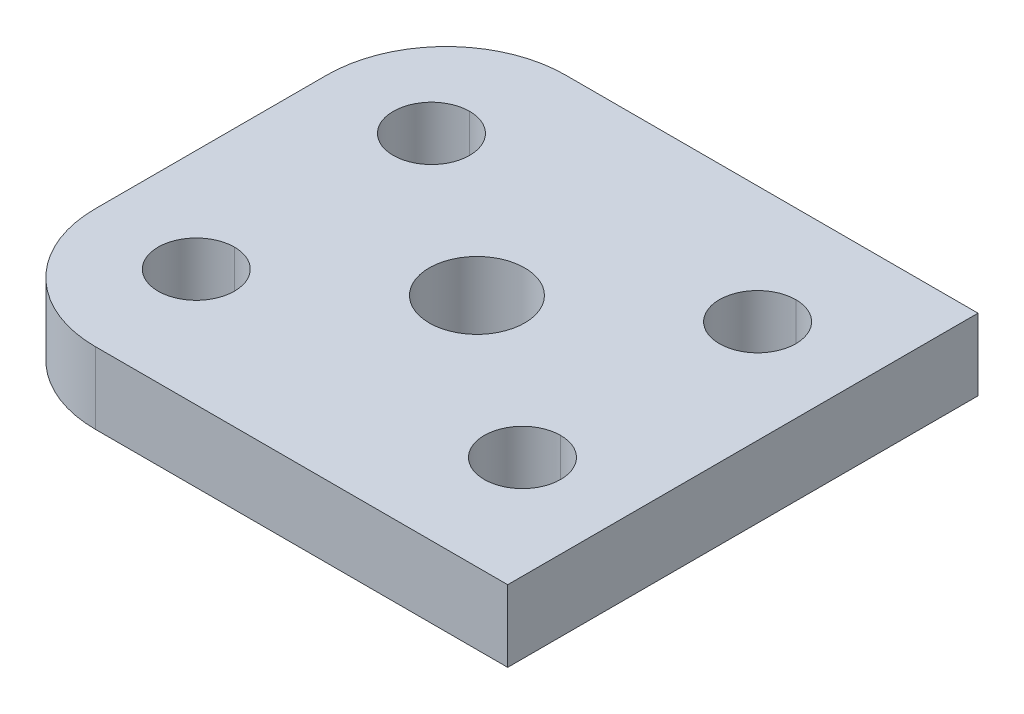
ISO-10303-21;
HEADER;
FILE_DESCRIPTION(('STEP AP214'),'2;1');
FILE_NAME('part.step','',(''),(''),'','','');
FILE_SCHEMA(('AUTOMOTIVE_DESIGN { 1 0 10303 214 1 1 1 1 }'));
ENDSEC;
DATA;
#1=APPLICATION_CONTEXT('core data for automotive mechanical design processes');
#2=APPLICATION_PROTOCOL_DEFINITION('international standard','automotive_design',2000,#1);
#3=PRODUCT_CONTEXT('',#1,'mechanical');
#4=PRODUCT('Part','Part','',(#3));
#5=PRODUCT_RELATED_PRODUCT_CATEGORY('part','',(#4));
#6=PRODUCT_DEFINITION_FORMATION('','',#4);
#7=PRODUCT_DEFINITION_CONTEXT('part definition',#1,'design');
#8=PRODUCT_DEFINITION('design','',#6,#7);
#9=PRODUCT_DEFINITION_SHAPE('','',#8);
#10=(LENGTH_UNIT() NAMED_UNIT(*) SI_UNIT(.MILLI.,.METRE.));
#11=(NAMED_UNIT(*) PLANE_ANGLE_UNIT() SI_UNIT($,.RADIAN.));
#12=(NAMED_UNIT(*) SI_UNIT($,.STERADIAN.) SOLID_ANGLE_UNIT());
#13=UNCERTAINTY_MEASURE_WITH_UNIT(LENGTH_MEASURE(1.E-05),#10,'distance_accuracy_value','');
#14=(GEOMETRIC_REPRESENTATION_CONTEXT(3) GLOBAL_UNCERTAINTY_ASSIGNED_CONTEXT((#13)) GLOBAL_UNIT_ASSIGNED_CONTEXT((#10,
#11,#12)) REPRESENTATION_CONTEXT('',''));
#15=CARTESIAN_POINT('',(0.,0.,0.));
#16=DIRECTION('',(0.,0.,1.));
#17=DIRECTION('',(1.,0.,0.));
#18=AXIS2_PLACEMENT_3D('',#15,#16,#17);
#19=CARTESIAN_POINT('',(-8.70071310472377,3.,-9.66703927731969));
#20=DIRECTION('',(0.,1.,0.));
#21=DIRECTION('',(0.,0.,1.));
#22=AXIS2_PLACEMENT_3D('',#19,#20,#21);
#23=CYLINDRICAL_SURFACE('',#22,5.);
#24=CARTESIAN_POINT('',(-8.70071310472377,3.,-9.66703927731969));
#25=DIRECTION('',(0.,1.,0.));
#26=DIRECTION('',(0.,0.,1.));
#27=AXIS2_PLACEMENT_3D('',#24,#25,#26);
#28=CIRCLE('',#27,5.);
#29=CARTESIAN_POINT('',(-8.70071310472377,3.,-14.6670392773197));
#30=VERTEX_POINT('',#29);
#31=CARTESIAN_POINT('',(-13.7007131047238,3.,-9.66703927731969));
#32=VERTEX_POINT('',#31);
#33=EDGE_CURVE('E246',#30,#32,#28,.T.);
#34=ORIENTED_EDGE('',*,*,#33,.F.);
#35=DIRECTION('',(0.,1.,0.));
#36=VECTOR('',#35,1.);
#37=CARTESIAN_POINT('',(-8.70071310472377,3.,-14.6670392773197));
#38=LINE('',#37,#36);
#39=CARTESIAN_POINT('',(-8.70071310472377,0.,-14.6670392773197));
#40=VERTEX_POINT('',#39);
#41=EDGE_CURVE('E248',#40,#30,#38,.T.);
#42=ORIENTED_EDGE('',*,*,#41,.F.);
#43=CARTESIAN_POINT('',(-8.70071310472377,0.,-9.66703927731969));
#44=DIRECTION('',(0.,-1.,0.));
#45=DIRECTION('',(0.,0.,1.));
#46=AXIS2_PLACEMENT_3D('',#43,#44,#45);
#47=CIRCLE('',#46,5.);
#48=CARTESIAN_POINT('',(-13.7007131047238,0.,-9.66703927731969));
#49=VERTEX_POINT('',#48);
#50=EDGE_CURVE('E281',#49,#40,#47,.T.);
#51=ORIENTED_EDGE('',*,*,#50,.F.);
#52=DIRECTION('',(0.,-1.,0.));
#53=VECTOR('',#52,1.);
#54=CARTESIAN_POINT('',(-13.7007131047238,0.,-9.66703927731969));
#55=LINE('',#54,#53);
#56=EDGE_CURVE('E11',#32,#49,#55,.T.);
#57=ORIENTED_EDGE('',*,*,#56,.F.);
#58=EDGE_LOOP('',(#34,#42,#51,#57));
#59=FACE_BOUND('',#58,.T.);
#60=ADVANCED_FACE('F51',(#59),#23,.T.);
#61=CARTESIAN_POINT('',(-8.70071310472377,3.,0.0329607226803095));
#62=DIRECTION('',(0.,1.,0.));
#63=DIRECTION('',(0.,0.,1.));
#64=AXIS2_PLACEMENT_3D('',#61,#62,#63);
#65=CYLINDRICAL_SURFACE('',#64,5.);
#66=CARTESIAN_POINT('',(-8.70071310472377,3.,0.0329607226803095));
#67=DIRECTION('',(0.,1.,0.));
#68=DIRECTION('',(0.,0.,1.));
#69=AXIS2_PLACEMENT_3D('',#66,#67,#68);
#70=CIRCLE('',#69,5.);
#71=CARTESIAN_POINT('',(-13.7007131047238,3.,0.03296072268031));
#72=VERTEX_POINT('',#71);
#73=CARTESIAN_POINT('',(-8.70071310472377,3.,5.03296072268031));
#74=VERTEX_POINT('',#73);
#75=EDGE_CURVE('E286',#72,#74,#70,.T.);
#76=ORIENTED_EDGE('',*,*,#75,.F.);
#77=DIRECTION('',(0.,1.,0.));
#78=VECTOR('',#77,1.);
#79=CARTESIAN_POINT('',(-13.7007131047238,3.,0.0329607226803095));
#80=LINE('',#79,#78);
#81=CARTESIAN_POINT('',(-13.7007131047238,0.,0.03296072268031));
#82=VERTEX_POINT('',#81);
#83=EDGE_CURVE('E62',#82,#72,#80,.T.);
#84=ORIENTED_EDGE('',*,*,#83,.F.);
#85=CARTESIAN_POINT('',(-8.70071310472377,0.,0.0329607226803095));
#86=DIRECTION('',(0.,-1.,0.));
#87=DIRECTION('',(0.,0.,1.));
#88=AXIS2_PLACEMENT_3D('',#85,#86,#87);
#89=CIRCLE('',#88,5.);
#90=CARTESIAN_POINT('',(-8.70071310472377,0.,5.03296072268031));
#91=VERTEX_POINT('',#90);
#92=EDGE_CURVE('E282',#91,#82,#89,.T.);
#93=ORIENTED_EDGE('',*,*,#92,.F.);
#94=DIRECTION('',(0.,-1.,0.));
#95=VECTOR('',#94,1.);
#96=CARTESIAN_POINT('',(-8.70071310472377,0.,5.03296072268031));
#97=LINE('',#96,#95);
#98=EDGE_CURVE('E55',#74,#91,#97,.T.);
#99=ORIENTED_EDGE('',*,*,#98,.F.);
#100=EDGE_LOOP('',(#76,#84,#93,#99));
#101=FACE_BOUND('',#100,.T.);
#102=ADVANCED_FACE('F497',(#101),#65,.T.);
#103=CARTESIAN_POINT('',(-13.7007131047238,3.,-14.6670392773197));
#104=DIRECTION('',(-1.,0.,0.));
#105=DIRECTION('',(0.,0.,1.));
#106=AXIS2_PLACEMENT_3D('',#103,#104,#105);
#107=PLANE('',#106);
#108=DIRECTION('',(0.,0.,-1.));
#109=VECTOR('',#108,1.);
#110=CARTESIAN_POINT('',(-13.7007131047238,0.,-14.6670392773197));
#111=LINE('',#110,#109);
#112=EDGE_CURVE('E277',#82,#49,#111,.T.);
#113=ORIENTED_EDGE('',*,*,#112,.F.);
#114=ORIENTED_EDGE('',*,*,#83,.T.);
#115=DIRECTION('',(0.,0.,-1.));
#116=VECTOR('',#115,1.);
#117=CARTESIAN_POINT('',(-13.7007131047238,3.,-14.6670392773197));
#118=LINE('',#117,#116);
#119=EDGE_CURVE('E283',#72,#32,#118,.T.);
#120=ORIENTED_EDGE('',*,*,#119,.T.);
#121=ORIENTED_EDGE('',*,*,#56,.T.);
#122=EDGE_LOOP('',(#113,#114,#120,#121));
#123=FACE_BOUND('',#122,.T.);
#124=ADVANCED_FACE('F501',(#123),#107,.T.);
#125=CARTESIAN_POINT('',(0.,0.,0.));
#126=DIRECTION('',(0.,1.,0.));
#127=DIRECTION('',(1.,0.,0.));
#128=AXIS2_PLACEMENT_3D('',#125,#126,#127);
#129=PLANE('',#128);
#130=CARTESIAN_POINT('',(4.26861546934696,0.,-9.74203927685791));
#131=DIRECTION('',(0.,1.,0.));
#132=DIRECTION('',(0.,0.,1.));
#133=AXIS2_PLACEMENT_3D('',#130,#131,#132);
#134=CIRCLE('',#133,1.6);
#135=CARTESIAN_POINT('',(4.26861546934696,0.,-11.3420392768579));
#136=VERTEX_POINT('',#135);
#137=CARTESIAN_POINT('',(4.26861546934696,0.,-8.14203927685791));
#138=VERTEX_POINT('',#137);
#139=EDGE_CURVE('E296',#136,#138,#134,.T.);
#140=ORIENTED_EDGE('',*,*,#139,.T.);
#141=CARTESIAN_POINT('',(4.26861546934696,0.,-9.74203927685791));
#142=DIRECTION('',(0.,1.,0.));
#143=DIRECTION('',(0.,0.,1.));
#144=AXIS2_PLACEMENT_3D('',#141,#142,#143);
#145=CIRCLE('',#144,1.6);
#146=EDGE_CURVE('E185',#138,#136,#145,.T.);
#147=ORIENTED_EDGE('',*,*,#146,.T.);
#148=EDGE_LOOP('',(#140,#147));
#149=FACE_BOUND('',#148,.T.);
#150=CARTESIAN_POINT('',(4.26861546934696,0.,0.107960722834236));
#151=DIRECTION('',(0.,1.,0.));
#152=DIRECTION('',(0.,0.,1.));
#153=AXIS2_PLACEMENT_3D('',#150,#151,#152);
#154=CIRCLE('',#153,1.6);
#155=CARTESIAN_POINT('',(4.26861546934696,0.,-1.49203927716576));
#156=VERTEX_POINT('',#155);
#157=CARTESIAN_POINT('',(4.26861546934696,0.,1.70796072283424));
#158=VERTEX_POINT('',#157);
#159=EDGE_CURVE('E198',#156,#158,#154,.T.);
#160=ORIENTED_EDGE('',*,*,#159,.T.);
#161=CARTESIAN_POINT('',(4.26861546934696,0.,0.107960722834236));
#162=DIRECTION('',(0.,1.,0.));
#163=DIRECTION('',(0.,0.,1.));
#164=AXIS2_PLACEMENT_3D('',#161,#162,#163);
#165=CIRCLE('',#164,1.6);
#166=EDGE_CURVE('E225',#158,#156,#165,.T.);
#167=ORIENTED_EDGE('',*,*,#166,.T.);
#168=EDGE_LOOP('',(#160,#167));
#169=FACE_BOUND('',#168,.T.);
#170=CARTESIAN_POINT('',(-9.39402681652373,0.,0.107960722834236));
#171=DIRECTION('',(0.,-1.,0.));
#172=DIRECTION('',(0.,0.,1.));
#173=AXIS2_PLACEMENT_3D('',#170,#171,#172);
#174=CIRCLE('',#173,1.6);
#175=CARTESIAN_POINT('',(-9.39402681652373,0.,-1.49203927716576));
#176=VERTEX_POINT('',#175);
#177=CARTESIAN_POINT('',(-9.39402681652373,0.,1.70796072283424));
#178=VERTEX_POINT('',#177);
#179=EDGE_CURVE('E162',#176,#178,#174,.T.);
#180=ORIENTED_EDGE('',*,*,#179,.F.);
#181=CARTESIAN_POINT('',(-9.39402681652373,0.,0.107960722834236));
#182=DIRECTION('',(0.,-1.,0.));
#183=DIRECTION('',(0.,0.,1.));
#184=AXIS2_PLACEMENT_3D('',#181,#182,#183);
#185=CIRCLE('',#184,1.6);
#186=EDGE_CURVE('E172',#178,#176,#185,.T.);
#187=ORIENTED_EDGE('',*,*,#186,.F.);
#188=EDGE_LOOP('',(#180,#187));
#189=FACE_BOUND('',#188,.T.);
#190=CARTESIAN_POINT('',(-9.39402681652373,0.,-9.74203927685791));
#191=DIRECTION('',(0.,-1.,0.));
#192=DIRECTION('',(0.,0.,1.));
#193=AXIS2_PLACEMENT_3D('',#190,#191,#192);
#194=CIRCLE('',#193,1.6);
#195=CARTESIAN_POINT('',(-9.39402681652373,0.,-11.3420392768579));
#196=VERTEX_POINT('',#195);
#197=CARTESIAN_POINT('',(-9.39402681652373,0.,-8.14203927685791));
#198=VERTEX_POINT('',#197);
#199=EDGE_CURVE('E208',#196,#198,#194,.T.);
#200=ORIENTED_EDGE('',*,*,#199,.F.);
#201=CARTESIAN_POINT('',(-9.39402681652373,0.,-9.74203927685791));
#202=DIRECTION('',(0.,-1.,0.));
#203=DIRECTION('',(0.,0.,1.));
#204=AXIS2_PLACEMENT_3D('',#201,#202,#203);
#205=CIRCLE('',#204,1.6);
#206=EDGE_CURVE('E181',#198,#196,#205,.T.);
#207=ORIENTED_EDGE('',*,*,#206,.F.);
#208=EDGE_LOOP('',(#200,#207));
#209=FACE_BOUND('',#208,.T.);
#210=DIRECTION('',(1.,0.,0.));
#211=VECTOR('',#210,1.);
#212=CARTESIAN_POINT('',(0.,0.,5.03296072268031));
#213=LINE('',#212,#211);
#214=CARTESIAN_POINT('',(8.57530175754701,0.,5.03296072268031));
#215=VERTEX_POINT('',#214);
#216=EDGE_CURVE('E189',#91,#215,#213,.T.);
#217=ORIENTED_EDGE('',*,*,#216,.F.);
#218=ORIENTED_EDGE('',*,*,#92,.T.);
#219=ORIENTED_EDGE('',*,*,#112,.T.);
#220=ORIENTED_EDGE('',*,*,#50,.T.);
#221=DIRECTION('',(-1.,0.,0.));
#222=VECTOR('',#221,1.);
#223=CARTESIAN_POINT('',(0.,0.,-14.6670392773197));
#224=LINE('',#223,#222);
#225=CARTESIAN_POINT('',(8.57530175754701,0.,-14.6670392773197));
#226=VERTEX_POINT('',#225);
#227=EDGE_CURVE('E215',#226,#40,#224,.T.);
#228=ORIENTED_EDGE('',*,*,#227,.F.);
#229=DIRECTION('',(0.,0.,1.));
#230=VECTOR('',#229,1.);
#231=CARTESIAN_POINT('',(8.57530175754701,0.,0.));
#232=LINE('',#231,#230);
#233=EDGE_CURVE('E197',#226,#215,#232,.T.);
#234=ORIENTED_EDGE('',*,*,#233,.T.);
#235=EDGE_LOOP('',(#217,#218,#219,#220,#228,#234));
#236=FACE_BOUND('',#235,.T.);
#237=CARTESIAN_POINT('',(-2.56270567358838,0.,-4.81703927731969));
#238=DIRECTION('',(0.,1.,0.));
#239=DIRECTION('',(0.,0.,1.));
#240=AXIS2_PLACEMENT_3D('',#237,#238,#239);
#241=CIRCLE('',#240,2.);
#242=CARTESIAN_POINT('',(-2.56270567358838,0.,-2.81703927731969));
#243=VERTEX_POINT('',#242);
#244=EDGE_CURVE('E311',#243,#243,#241,.F.);
#245=ORIENTED_EDGE('',*,*,#244,.F.);
#246=EDGE_LOOP('',(#245));
#247=FACE_BOUND('',#246,.T.);
#248=ADVANCED_FACE('F53',(#149,#169,#189,#209,#236,#247),#129,.F.);
#249=CARTESIAN_POINT('',(0.,3.,0.));
#250=DIRECTION('',(0.,1.,0.));
#251=DIRECTION('',(1.,0.,0.));
#252=AXIS2_PLACEMENT_3D('',#249,#250,#251);
#253=PLANE('',#252);
#254=CARTESIAN_POINT('',(4.26861546934696,3.,-9.74203927685791));
#255=DIRECTION('',(0.,1.,0.));
#256=DIRECTION('',(0.,0.,1.));
#257=AXIS2_PLACEMENT_3D('',#254,#255,#256);
#258=CIRCLE('',#257,1.6);
#259=CARTESIAN_POINT('',(4.26861546934696,3.,-11.3420392768579));
#260=VERTEX_POINT('',#259);
#261=CARTESIAN_POINT('',(4.26861546934696,3.,-8.14203927685791));
#262=VERTEX_POINT('',#261);
#263=EDGE_CURVE('E305',#260,#262,#258,.T.);
#264=ORIENTED_EDGE('',*,*,#263,.F.);
#265=CARTESIAN_POINT('',(4.26861546934696,3.,-9.74203927685791));
#266=DIRECTION('',(0.,1.,0.));
#267=DIRECTION('',(0.,0.,1.));
#268=AXIS2_PLACEMENT_3D('',#265,#266,#267);
#269=CIRCLE('',#268,1.6);
#270=EDGE_CURVE('E221',#262,#260,#269,.T.);
#271=ORIENTED_EDGE('',*,*,#270,.F.);
#272=EDGE_LOOP('',(#264,#271));
#273=FACE_BOUND('',#272,.T.);
#274=CARTESIAN_POINT('',(4.26861546934696,3.,0.107960722834236));
#275=DIRECTION('',(0.,1.,0.));
#276=DIRECTION('',(0.,0.,1.));
#277=AXIS2_PLACEMENT_3D('',#274,#275,#276);
#278=CIRCLE('',#277,1.6);
#279=CARTESIAN_POINT('',(4.26861546934696,3.,-1.49203927716576));
#280=VERTEX_POINT('',#279);
#281=CARTESIAN_POINT('',(4.26861546934696,3.,1.70796072283424));
#282=VERTEX_POINT('',#281);
#283=EDGE_CURVE('E266',#280,#282,#278,.T.);
#284=ORIENTED_EDGE('',*,*,#283,.F.);
#285=CARTESIAN_POINT('',(4.26861546934696,3.,0.107960722834236));
#286=DIRECTION('',(0.,1.,0.));
#287=DIRECTION('',(0.,0.,1.));
#288=AXIS2_PLACEMENT_3D('',#285,#286,#287);
#289=CIRCLE('',#288,1.6);
#290=EDGE_CURVE('E256',#282,#280,#289,.T.);
#291=ORIENTED_EDGE('',*,*,#290,.F.);
#292=EDGE_LOOP('',(#284,#291));
#293=FACE_BOUND('',#292,.T.);
#294=CARTESIAN_POINT('',(-9.39402681652373,3.,0.107960722834236));
#295=DIRECTION('',(0.,-1.,0.));
#296=DIRECTION('',(0.,0.,1.));
#297=AXIS2_PLACEMENT_3D('',#294,#295,#296);
#298=CIRCLE('',#297,1.6);
#299=CARTESIAN_POINT('',(-9.39402681652373,3.,-1.49203927716576));
#300=VERTEX_POINT('',#299);
#301=CARTESIAN_POINT('',(-9.39402681652373,3.,1.70796072283424));
#302=VERTEX_POINT('',#301);
#303=EDGE_CURVE('E152',#300,#302,#298,.T.);
#304=ORIENTED_EDGE('',*,*,#303,.T.);
#305=CARTESIAN_POINT('',(-9.39402681652373,3.,0.107960722834236));
#306=DIRECTION('',(0.,-1.,0.));
#307=DIRECTION('',(0.,0.,1.));
#308=AXIS2_PLACEMENT_3D('',#305,#306,#307);
#309=CIRCLE('',#308,1.6);
#310=EDGE_CURVE('E157',#302,#300,#309,.T.);
#311=ORIENTED_EDGE('',*,*,#310,.T.);
#312=EDGE_LOOP('',(#304,#311));
#313=FACE_BOUND('',#312,.T.);
#314=CARTESIAN_POINT('',(-9.39402681652373,3.,-9.74203927685791));
#315=DIRECTION('',(0.,-1.,0.));
#316=DIRECTION('',(0.,0.,1.));
#317=AXIS2_PLACEMENT_3D('',#314,#315,#316);
#318=CIRCLE('',#317,1.6);
#319=CARTESIAN_POINT('',(-9.39402681652373,3.,-11.3420392768579));
#320=VERTEX_POINT('',#319);
#321=CARTESIAN_POINT('',(-9.39402681652373,3.,-8.14203927685791));
#322=VERTEX_POINT('',#321);
#323=EDGE_CURVE('E230',#320,#322,#318,.T.);
#324=ORIENTED_EDGE('',*,*,#323,.T.);
#325=CARTESIAN_POINT('',(-9.39402681652373,3.,-9.74203927685791));
#326=DIRECTION('',(0.,-1.,0.));
#327=DIRECTION('',(0.,0.,1.));
#328=AXIS2_PLACEMENT_3D('',#325,#326,#327);
#329=CIRCLE('',#328,1.6);
#330=EDGE_CURVE('E228',#322,#320,#329,.T.);
#331=ORIENTED_EDGE('',*,*,#330,.T.);
#332=EDGE_LOOP('',(#324,#331));
#333=FACE_BOUND('',#332,.T.);
#334=ORIENTED_EDGE('',*,*,#119,.F.);
#335=ORIENTED_EDGE('',*,*,#75,.T.);
#336=DIRECTION('',(1.,0.,0.));
#337=VECTOR('',#336,1.);
#338=CARTESIAN_POINT('',(0.,3.,5.03296072268031));
#339=LINE('',#338,#337);
#340=CARTESIAN_POINT('',(8.57530175754701,3.,5.03296072268031));
#341=VERTEX_POINT('',#340);
#342=EDGE_CURVE('E204',#74,#341,#339,.T.);
#343=ORIENTED_EDGE('',*,*,#342,.T.);
#344=DIRECTION('',(0.,0.,1.));
#345=VECTOR('',#344,1.);
#346=CARTESIAN_POINT('',(8.57530175754701,3.,0.));
#347=LINE('',#346,#345);
#348=CARTESIAN_POINT('',(8.57530175754701,3.,-14.6670392773197));
#349=VERTEX_POINT('',#348);
#350=EDGE_CURVE('E211',#349,#341,#347,.T.);
#351=ORIENTED_EDGE('',*,*,#350,.F.);
#352=DIRECTION('',(-1.,0.,0.));
#353=VECTOR('',#352,1.);
#354=CARTESIAN_POINT('',(0.,3.,-14.6670392773197));
#355=LINE('',#354,#353);
#356=EDGE_CURVE('E252',#349,#30,#355,.T.);
#357=ORIENTED_EDGE('',*,*,#356,.T.);
#358=ORIENTED_EDGE('',*,*,#33,.T.);
#359=EDGE_LOOP('',(#334,#335,#343,#351,#357,#358));
#360=FACE_BOUND('',#359,.T.);
#361=CARTESIAN_POINT('',(-2.56270567358838,3.,-4.81703927731969));
#362=DIRECTION('',(0.,1.,0.));
#363=DIRECTION('',(0.,0.,1.));
#364=AXIS2_PLACEMENT_3D('',#361,#362,#363);
#365=CIRCLE('',#364,2.);
#366=CARTESIAN_POINT('',(-2.56270567358838,3.,-2.81703927731969));
#367=VERTEX_POINT('',#366);
#368=EDGE_CURVE('E749',#367,#367,#365,.T.);
#369=ORIENTED_EDGE('',*,*,#368,.F.);
#370=EDGE_LOOP('',(#369));
#371=FACE_BOUND('',#370,.T.);
#372=ADVANCED_FACE('F154',(#273,#293,#313,#333,#360,#371),#253,.T.);
#373=CARTESIAN_POINT('',(4.26861546934696,3.,-9.74203927685791));
#374=DIRECTION('',(0.,-1.,0.));
#375=DIRECTION('',(0.,0.,-1.));
#376=AXIS2_PLACEMENT_3D('',#373,#374,#375);
#377=CYLINDRICAL_SURFACE('',#376,1.6);
#378=DIRECTION('',(0.,-1.,0.));
#379=VECTOR('',#378,1.);
#380=CARTESIAN_POINT('',(4.26861546934696,3.,-8.14203927685791));
#381=LINE('',#380,#379);
#382=EDGE_CURVE('E301',#262,#138,#381,.T.);
#383=ORIENTED_EDGE('',*,*,#382,.F.);
#384=ORIENTED_EDGE('',*,*,#270,.T.);
#385=DIRECTION('',(0.,-1.,0.));
#386=VECTOR('',#385,1.);
#387=CARTESIAN_POINT('',(4.26861546934696,3.,-11.3420392768579));
#388=LINE('',#387,#386);
#389=EDGE_CURVE('E270',#260,#136,#388,.T.);
#390=ORIENTED_EDGE('',*,*,#389,.T.);
#391=ORIENTED_EDGE('',*,*,#146,.F.);
#392=EDGE_LOOP('',(#383,#384,#390,#391));
#393=FACE_BOUND('',#392,.T.);
#394=ADVANCED_FACE('F328',(#393),#377,.F.);
#395=CARTESIAN_POINT('',(4.26861546934696,3.,0.107960722834236));
#396=DIRECTION('',(0.,-1.,0.));
#397=DIRECTION('',(0.,0.,-1.));
#398=AXIS2_PLACEMENT_3D('',#395,#396,#397);
#399=CYLINDRICAL_SURFACE('',#398,1.6);
#400=DIRECTION('',(0.,-1.,0.));
#401=VECTOR('',#400,1.);
#402=CARTESIAN_POINT('',(4.26861546934696,3.,1.70796072283424));
#403=LINE('',#402,#401);
#404=EDGE_CURVE('E203',#282,#158,#403,.T.);
#405=ORIENTED_EDGE('',*,*,#404,.F.);
#406=ORIENTED_EDGE('',*,*,#290,.T.);
#407=DIRECTION('',(0.,-1.,0.));
#408=VECTOR('',#407,1.);
#409=CARTESIAN_POINT('',(4.26861546934696,3.,-1.49203927716576));
#410=LINE('',#409,#408);
#411=EDGE_CURVE('E202',#280,#156,#410,.T.);
#412=ORIENTED_EDGE('',*,*,#411,.T.);
#413=ORIENTED_EDGE('',*,*,#166,.F.);
#414=EDGE_LOOP('',(#405,#406,#412,#413));
#415=FACE_BOUND('',#414,.T.);
#416=ADVANCED_FACE('F518',(#415),#399,.F.);
#417=CARTESIAN_POINT('',(0.,3.,-14.6670392773197));
#418=DIRECTION('',(0.,0.,1.));
#419=DIRECTION('',(1.,0.,0.));
#420=AXIS2_PLACEMENT_3D('',#417,#418,#419);
#421=PLANE('',#420);
#422=ORIENTED_EDGE('',*,*,#227,.T.);
#423=ORIENTED_EDGE('',*,*,#41,.T.);
#424=ORIENTED_EDGE('',*,*,#356,.F.);
#425=DIRECTION('',(0.,-1.,0.));
#426=VECTOR('',#425,1.);
#427=CARTESIAN_POINT('',(8.57530175754701,3.,-14.6670392773197));
#428=LINE('',#427,#426);
#429=EDGE_CURVE('E216',#349,#226,#428,.T.);
#430=ORIENTED_EDGE('',*,*,#429,.T.);
#431=EDGE_LOOP('',(#422,#423,#424,#430));
#432=FACE_BOUND('',#431,.T.);
#433=ADVANCED_FACE('F561',(#432),#421,.F.);
#434=CARTESIAN_POINT('',(8.57530175754701,3.,0.));
#435=DIRECTION('',(1.,0.,0.));
#436=DIRECTION('',(0.,1.,0.));
#437=AXIS2_PLACEMENT_3D('',#434,#435,#436);
#438=PLANE('',#437);
#439=ORIENTED_EDGE('',*,*,#233,.F.);
#440=ORIENTED_EDGE('',*,*,#429,.F.);
#441=ORIENTED_EDGE('',*,*,#350,.T.);
#442=DIRECTION('',(0.,-1.,0.));
#443=VECTOR('',#442,1.);
#444=CARTESIAN_POINT('',(8.57530175754701,3.,5.03296072268031));
#445=LINE('',#444,#443);
#446=EDGE_CURVE('E193',#341,#215,#445,.T.);
#447=ORIENTED_EDGE('',*,*,#446,.T.);
#448=EDGE_LOOP('',(#439,#440,#441,#447));
#449=FACE_BOUND('',#448,.T.);
#450=ADVANCED_FACE('F556',(#449),#438,.T.);
#451=CARTESIAN_POINT('',(0.,3.,5.03296072268031));
#452=DIRECTION('',(0.,0.,-1.));
#453=DIRECTION('',(-1.,0.,0.));
#454=AXIS2_PLACEMENT_3D('',#451,#452,#453);
#455=PLANE('',#454);
#456=ORIENTED_EDGE('',*,*,#342,.F.);
#457=ORIENTED_EDGE('',*,*,#98,.T.);
#458=ORIENTED_EDGE('',*,*,#216,.T.);
#459=ORIENTED_EDGE('',*,*,#446,.F.);
#460=EDGE_LOOP('',(#456,#457,#458,#459));
#461=FACE_BOUND('',#460,.T.);
#462=ADVANCED_FACE('F560',(#461),#455,.F.);
#463=CARTESIAN_POINT('',(-9.39402681652373,3.,-9.74203927685791));
#464=DIRECTION('',(0.,-1.,0.));
#465=DIRECTION('',(0.,0.,-1.));
#466=AXIS2_PLACEMENT_3D('',#463,#464,#465);
#467=CYLINDRICAL_SURFACE('',#466,1.6);
#468=DIRECTION('',(0.,-1.,0.));
#469=VECTOR('',#468,1.);
#470=CARTESIAN_POINT('',(-9.39402681652373,3.,-8.14203927685791));
#471=LINE('',#470,#469);
#472=EDGE_CURVE('E220',#322,#198,#471,.T.);
#473=ORIENTED_EDGE('',*,*,#472,.F.);
#474=ORIENTED_EDGE('',*,*,#323,.F.);
#475=DIRECTION('',(0.,-1.,0.));
#476=VECTOR('',#475,1.);
#477=CARTESIAN_POINT('',(-9.39402681652373,3.,-11.3420392768579));
#478=LINE('',#477,#476);
#479=EDGE_CURVE('E176',#320,#196,#478,.T.);
#480=ORIENTED_EDGE('',*,*,#479,.T.);
#481=ORIENTED_EDGE('',*,*,#199,.T.);
#482=EDGE_LOOP('',(#473,#474,#480,#481));
#483=FACE_BOUND('',#482,.T.);
#484=ADVANCED_FACE('F543',(#483),#467,.F.);
#485=CARTESIAN_POINT('',(-9.39402681652373,3.,0.107960722834236));
#486=DIRECTION('',(0.,-1.,0.));
#487=DIRECTION('',(0.,0.,-1.));
#488=AXIS2_PLACEMENT_3D('',#485,#486,#487);
#489=CYLINDRICAL_SURFACE('',#488,1.6);
#490=DIRECTION('',(0.,-1.,0.));
#491=VECTOR('',#490,1.);
#492=CARTESIAN_POINT('',(-9.39402681652373,3.,1.70796072283424));
#493=LINE('',#492,#491);
#494=EDGE_CURVE('E166',#302,#178,#493,.T.);
#495=ORIENTED_EDGE('',*,*,#494,.F.);
#496=ORIENTED_EDGE('',*,*,#303,.F.);
#497=DIRECTION('',(0.,-1.,0.));
#498=VECTOR('',#497,1.);
#499=CARTESIAN_POINT('',(-9.39402681652373,3.,-1.49203927716576));
#500=LINE('',#499,#498);
#501=EDGE_CURVE('E163',#300,#176,#500,.T.);
#502=ORIENTED_EDGE('',*,*,#501,.T.);
#503=ORIENTED_EDGE('',*,*,#179,.T.);
#504=EDGE_LOOP('',(#495,#496,#502,#503));
#505=FACE_BOUND('',#504,.T.);
#506=ADVANCED_FACE('F167',(#505),#489,.F.);
#507=CARTESIAN_POINT('',(-9.39402681652373,3.,0.107960722834236));
#508=DIRECTION('',(0.,-1.,0.));
#509=DIRECTION('',(0.,0.,-1.));
#510=AXIS2_PLACEMENT_3D('',#507,#508,#509);
#511=CYLINDRICAL_SURFACE('',#510,1.6);
#512=ORIENTED_EDGE('',*,*,#310,.F.);
#513=ORIENTED_EDGE('',*,*,#494,.T.);
#514=ORIENTED_EDGE('',*,*,#186,.T.);
#515=ORIENTED_EDGE('',*,*,#501,.F.);
#516=EDGE_LOOP('',(#512,#513,#514,#515));
#517=FACE_BOUND('',#516,.T.);
#518=ADVANCED_FACE('F174',(#517),#511,.F.);
#519=CARTESIAN_POINT('',(-9.39402681652373,3.,-9.74203927685791));
#520=DIRECTION('',(0.,-1.,0.));
#521=DIRECTION('',(0.,0.,-1.));
#522=AXIS2_PLACEMENT_3D('',#519,#520,#521);
#523=CYLINDRICAL_SURFACE('',#522,1.6);
#524=ORIENTED_EDGE('',*,*,#330,.F.);
#525=ORIENTED_EDGE('',*,*,#472,.T.);
#526=ORIENTED_EDGE('',*,*,#206,.T.);
#527=ORIENTED_EDGE('',*,*,#479,.F.);
#528=EDGE_LOOP('',(#524,#525,#526,#527));
#529=FACE_BOUND('',#528,.T.);
#530=ADVANCED_FACE('F526',(#529),#523,.F.);
#531=CARTESIAN_POINT('',(4.26861546934696,3.,0.107960722834236));
#532=DIRECTION('',(0.,-1.,0.));
#533=DIRECTION('',(0.,0.,-1.));
#534=AXIS2_PLACEMENT_3D('',#531,#532,#533);
#535=CYLINDRICAL_SURFACE('',#534,1.6);
#536=ORIENTED_EDGE('',*,*,#283,.T.);
#537=ORIENTED_EDGE('',*,*,#404,.T.);
#538=ORIENTED_EDGE('',*,*,#159,.F.);
#539=ORIENTED_EDGE('',*,*,#411,.F.);
#540=EDGE_LOOP('',(#536,#537,#538,#539));
#541=FACE_BOUND('',#540,.T.);
#542=ADVANCED_FACE('F531',(#541),#535,.F.);
#543=CARTESIAN_POINT('',(4.26861546934696,3.,-9.74203927685791));
#544=DIRECTION('',(0.,-1.,0.));
#545=DIRECTION('',(0.,0.,-1.));
#546=AXIS2_PLACEMENT_3D('',#543,#544,#545);
#547=CYLINDRICAL_SURFACE('',#546,1.6);
#548=ORIENTED_EDGE('',*,*,#263,.T.);
#549=ORIENTED_EDGE('',*,*,#382,.T.);
#550=ORIENTED_EDGE('',*,*,#139,.F.);
#551=ORIENTED_EDGE('',*,*,#389,.F.);
#552=EDGE_LOOP('',(#548,#549,#550,#551));
#553=FACE_BOUND('',#552,.T.);
#554=ADVANCED_FACE('F325',(#553),#547,.F.);
#555=CARTESIAN_POINT('',(-2.56270567358838,-15.4556663682155,-4.81703927731969));
#556=DIRECTION('',(0.,1.,0.));
#557=DIRECTION('',(0.,0.,1.));
#558=AXIS2_PLACEMENT_3D('',#555,#556,#557);
#559=CYLINDRICAL_SURFACE('',#558,2.);
#560=ORIENTED_EDGE('',*,*,#244,.T.);
#561=EDGE_LOOP('',(#560));
#562=FACE_BOUND('',#561,.T.);
#563=ORIENTED_EDGE('',*,*,#368,.T.);
#564=EDGE_LOOP('',(#563));
#565=FACE_BOUND('',#564,.T.);
#566=ADVANCED_FACE('F577',(#562,#565),#559,.F.);
#567=CLOSED_SHELL('',(#60,#102,#124,#248,#372,#394,#416,#433,#450,#462,#484,#506,#518,#530,#542,
#554,#566));
#568=MANIFOLD_SOLID_BREP('B2',#567);
#569=ADVANCED_BREP_SHAPE_REPRESENTATION('',(#18,#568),#14);
#570=SHAPE_DEFINITION_REPRESENTATION(#9,#569);
ENDSEC;
END-ISO-10303-21;
